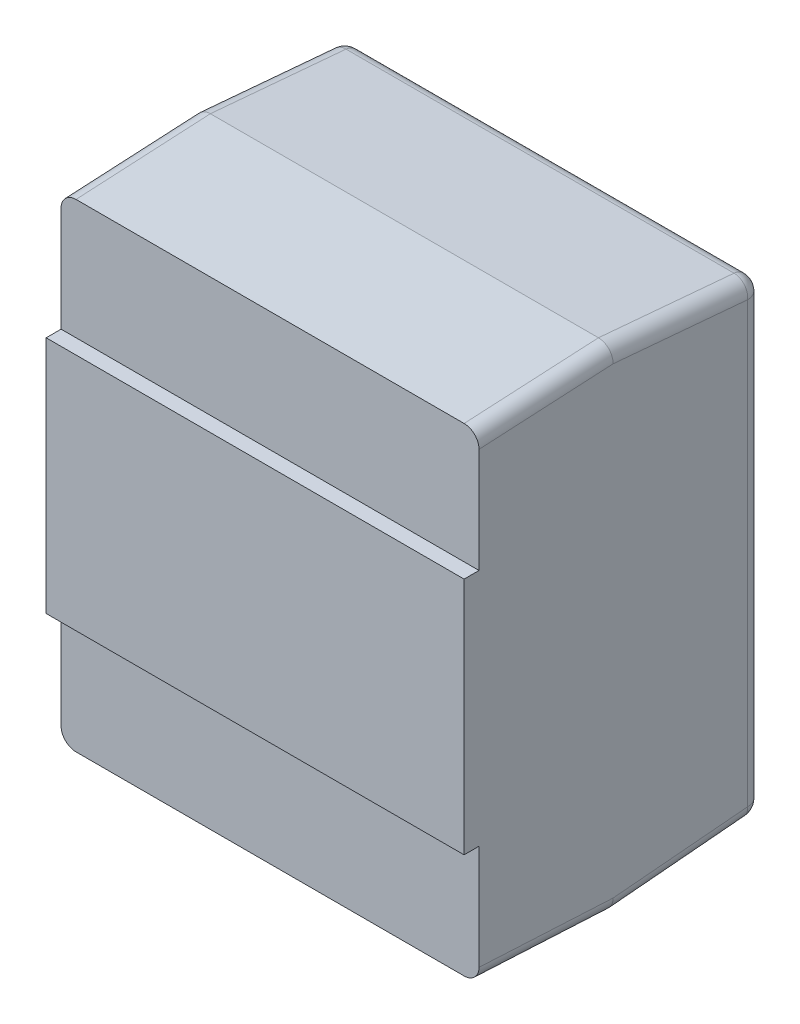
ISO-10303-21;
HEADER;
FILE_DESCRIPTION(('STEP AP214'),'2;1');
FILE_NAME('part.step','',(''),(''),'','','');
FILE_SCHEMA(('AUTOMOTIVE_DESIGN { 1 0 10303 214 1 1 1 1 }'));
ENDSEC;
DATA;
#1=APPLICATION_CONTEXT('core data for automotive mechanical design processes');
#2=APPLICATION_PROTOCOL_DEFINITION('international standard','automotive_design',2000,#1);
#3=PRODUCT_CONTEXT('',#1,'mechanical');
#4=PRODUCT('Part','Part','',(#3));
#5=PRODUCT_RELATED_PRODUCT_CATEGORY('part','',(#4));
#6=PRODUCT_DEFINITION_FORMATION('','',#4);
#7=PRODUCT_DEFINITION_CONTEXT('part definition',#1,'design');
#8=PRODUCT_DEFINITION('design','',#6,#7);
#9=PRODUCT_DEFINITION_SHAPE('','',#8);
#10=(LENGTH_UNIT() NAMED_UNIT(*) SI_UNIT(.MILLI.,.METRE.));
#11=(NAMED_UNIT(*) PLANE_ANGLE_UNIT() SI_UNIT($,.RADIAN.));
#12=(NAMED_UNIT(*) SI_UNIT($,.STERADIAN.) SOLID_ANGLE_UNIT());
#13=UNCERTAINTY_MEASURE_WITH_UNIT(LENGTH_MEASURE(1.E-05),#10,'distance_accuracy_value','');
#14=(GEOMETRIC_REPRESENTATION_CONTEXT(3) GLOBAL_UNCERTAINTY_ASSIGNED_CONTEXT((#13)) GLOBAL_UNIT_ASSIGNED_CONTEXT((#10,
#11,#12)) REPRESENTATION_CONTEXT('',''));
#15=CARTESIAN_POINT('',(0.,0.,0.));
#16=DIRECTION('',(0.,0.,1.));
#17=DIRECTION('',(1.,0.,0.));
#18=AXIS2_PLACEMENT_3D('',#15,#16,#17);
#19=CARTESIAN_POINT('',(18.49999934,-11.00000066,-1.611602067947));
#20=DIRECTION('',(0.,-8.74227767236097E-08,0.999999999999996));
#21=DIRECTION('',(0.,-0.999999999999996,-8.74227767236097E-08));
#22=AXIS2_PLACEMENT_3D('',#19,#20,#21);
#23=PLANE('',#22);
#24=DIRECTION('',(1.,-1.19248806067699E-08,0.));
#25=VECTOR('',#24,1.);
#26=CARTESIAN_POINT('',(20.29999934954,-10.20000068146,-1.611601998009));
#27=LINE('',#26,#25);
#28=CARTESIAN_POINT('',(19.89999934318,-10.20000067669,-1.61160199800893));
#29=VERTEX_POINT('',#28);
#30=CARTESIAN_POINT('',(17.09999934954,-10.2000006544303,-1.61160199800892));
#31=VERTEX_POINT('',#30);
#32=EDGE_CURVE('E285',#29,#31,#27,.F.);
#33=ORIENTED_EDGE('',*,*,#32,.T.);
#34=DIRECTION('',(0.,-0.999999999999996,-8.74227767236097E-08));
#35=VECTOR('',#34,1.);
#36=CARTESIAN_POINT('',(17.09999934954,-11.00000066,-1.611602067947));
#37=LINE('',#36,#35);
#38=CARTESIAN_POINT('',(17.09999933682,-11.8000006433,-1.61160213788574));
#39=VERTEX_POINT('',#38);
#40=EDGE_CURVE('E303',#31,#39,#37,.T.);
#41=ORIENTED_EDGE('',*,*,#40,.T.);
#42=DIRECTION('',(1.,-1.19248806067699E-08,0.));
#43=VECTOR('',#42,1.);
#44=CARTESIAN_POINT('',(16.69999933046,-11.80000063853,-1.611602137886));
#45=LINE('',#44,#43);
#46=CARTESIAN_POINT('',(19.89999933046,-11.8000006655597,-1.61160213788574));
#47=VERTEX_POINT('',#46);
#48=EDGE_CURVE('E298',#39,#47,#45,.T.);
#49=ORIENTED_EDGE('',*,*,#48,.T.);
#50=DIRECTION('',(0.,-0.999999999999996,-8.74227767236097E-08));
#51=VECTOR('',#50,1.);
#52=CARTESIAN_POINT('',(19.89999933046,-11.00000066,-1.611602067947));
#53=LINE('',#52,#51);
#54=EDGE_CURVE('E310',#47,#29,#53,.F.);
#55=ORIENTED_EDGE('',*,*,#54,.T.);
#56=EDGE_LOOP('',(#33,#41,#49,#55));
#57=FACE_BOUND('',#56,.T.);
#58=ADVANCED_FACE('F17',(#57),#23,.T.);
#59=CARTESIAN_POINT('',(16.69999933046,-11.80000063853,-1.611602137886));
#60=DIRECTION('',(1.192488060677E-08,0.999999999999996,8.74227767236097E-08));
#61=DIRECTION('',(0.,-8.74227767236097E-08,0.999999999999996));
#62=AXIS2_PLACEMENT_3D('',#59,#60,#61);
#63=PLANE('',#62);
#64=ORIENTED_EDGE('',*,*,#48,.F.);
#65=DIRECTION('',(0.,-8.74227767236097E-08,0.999999999999996));
#66=VECTOR('',#65,1.);
#67=CARTESIAN_POINT('',(17.09999933046,-11.8000006433,-1.611602137886));
#68=LINE('',#67,#66);
#69=CARTESIAN_POINT('',(17.099999324874,-11.8000006345592,-1.71160213788519));
#70=VERTEX_POINT('',#69);
#71=EDGE_CURVE('E301',#70,#39,#68,.T.);
#72=ORIENTED_EDGE('',*,*,#71,.F.);
#73=DIRECTION('',(1.,0.,0.));
#74=VECTOR('',#73,1.);
#75=CARTESIAN_POINT('',(18.499999322709,-11.80000063456,-1.71160213788519));
#76=LINE('',#75,#74);
#77=CARTESIAN_POINT('',(19.89999933046,-11.8000006456891,-1.71160213788546));
#78=VERTEX_POINT('',#77);
#79=EDGE_CURVE('E273',#70,#78,#76,.T.);
#80=ORIENTED_EDGE('',*,*,#79,.T.);
#81=DIRECTION('',(0.,-8.74227767236097E-08,0.999999999999996));
#82=VECTOR('',#81,1.);
#83=CARTESIAN_POINT('',(19.89999933046,-11.8000006766896,-1.611602137886));
#84=LINE('',#83,#82);
#85=EDGE_CURVE('E296',#47,#78,#84,.F.);
#86=ORIENTED_EDGE('',*,*,#85,.F.);
#87=EDGE_LOOP('',(#64,#72,#80,#86));
#88=FACE_BOUND('',#87,.T.);
#89=ADVANCED_FACE('F496',(#88),#63,.F.);
#90=CARTESIAN_POINT('',(20.29999934954,-10.20000068146,-1.611601998009));
#91=DIRECTION('',(-1.192488060677E-08,-0.999999999999996,-8.74227767236097E-08));
#92=DIRECTION('',(0.,8.74227767236097E-08,-0.999999999999996));
#93=AXIS2_PLACEMENT_3D('',#90,#91,#92);
#94=PLANE('',#93);
#95=DIRECTION('',(1.,0.,0.));
#96=VECTOR('',#95,1.);
#97=CARTESIAN_POINT('',(18.499999357291,-10.20000066795,-1.71160199800881));
#98=LINE('',#97,#96);
#99=CARTESIAN_POINT('',(19.899999355126,-10.2000006679493,-1.71160199800881));
#100=VERTEX_POINT('',#99);
#101=CARTESIAN_POINT('',(17.09999934954,-10.2000006568194,-1.71160199800887));
#102=VERTEX_POINT('',#101);
#103=EDGE_CURVE('E264',#100,#102,#98,.F.);
#104=ORIENTED_EDGE('',*,*,#103,.T.);
#105=DIRECTION('',(0.,8.74227767236097E-08,-0.999999999999996));
#106=VECTOR('',#105,1.);
#107=CARTESIAN_POINT('',(17.09999934954,-10.2000006433004,-1.611601998009));
#108=LINE('',#107,#106);
#109=EDGE_CURVE('E283',#31,#102,#108,.T.);
#110=ORIENTED_EDGE('',*,*,#109,.F.);
#111=ORIENTED_EDGE('',*,*,#32,.F.);
#112=DIRECTION('',(0.,8.74227767236097E-08,-0.999999999999996));
#113=VECTOR('',#112,1.);
#114=CARTESIAN_POINT('',(19.89999934954,-10.20000067669,-1.611601998009));
#115=LINE('',#114,#113);
#116=EDGE_CURVE('E153',#100,#29,#115,.F.);
#117=ORIENTED_EDGE('',*,*,#116,.F.);
#118=EDGE_LOOP('',(#104,#110,#111,#117));
#119=FACE_BOUND('',#118,.T.);
#120=ADVANCED_FACE('F494',(#119),#94,.F.);
#121=CARTESIAN_POINT('',(18.499999322709,-12.45000065125,-1.71160219471));
#122=DIRECTION('',(0.,8.74227767236097E-08,-0.999999999999996));
#123=DIRECTION('',(0.,0.999999999999996,8.74227767236097E-08));
#124=AXIS2_PLACEMENT_3D('',#121,#122,#123);
#125=PLANE('',#124);
#126=DIRECTION('',(0.,0.999999999999996,8.74227767236097E-08));
#127=VECTOR('',#126,1.);
#128=CARTESIAN_POINT('',(19.89999933046,-12.45000065125,-1.71160219471));
#129=LINE('',#128,#127);
#130=CARTESIAN_POINT('',(19.8999993241755,-12.5026964313939,-1.71160219931681));
#131=VERTEX_POINT('',#130);
#132=EDGE_CURVE('E269',#78,#131,#129,.F.);
#133=ORIENTED_EDGE('',*,*,#132,.F.);
#134=ORIENTED_EDGE('',*,*,#79,.F.);
#135=DIRECTION('',(0.,0.999999999999996,8.74227767236097E-08));
#136=VECTOR('',#135,1.);
#137=CARTESIAN_POINT('',(17.099999322081,-12.45000065125,-1.71160219471));
#138=LINE('',#137,#136);
#139=CARTESIAN_POINT('',(17.0999993220807,-12.5026963992011,-1.71160219931681));
#140=VERTEX_POINT('',#139);
#141=EDGE_CURVE('E148',#140,#70,#138,.T.);
#142=ORIENTED_EDGE('',*,*,#141,.F.);
#143=CARTESIAN_POINT('',(17.1999993220807,-12.5026963997989,-1.71160219931681));
#144=DIRECTION('',(0.,8.74227767236097E-08,-0.999999999999996));
#145=DIRECTION('',(-1.19248807609674E-08,-0.999999999999996,-8.74227767236097E-08));
#146=AXIS2_PLACEMENT_3D('',#143,#144,#145);
#147=ELLIPSE('',#146,0.100137234599792,0.1);
#148=CARTESIAN_POINT('',(17.1999993208882,-12.6028336344411,-1.71160220888117));
#149=VERTEX_POINT('',#148);
#150=EDGE_CURVE('E20',#149,#140,#147,.T.);
#151=ORIENTED_EDGE('',*,*,#150,.F.);
#152=DIRECTION('',(1.,-1.18922180420432E-08,6.23243695826995E-10));
#153=VECTOR('',#152,1.);
#154=CARTESIAN_POINT('',(19.899999320324,-12.6028336665925,-1.71160220800851));
#155=LINE('',#154,#153);
#156=CARTESIAN_POINT('',(19.799999320607,-12.6028336654021,-1.71160220807096));
#157=VERTEX_POINT('',#156);
#158=EDGE_CURVE('E145',#157,#149,#155,.F.);
#159=ORIENTED_EDGE('',*,*,#158,.F.);
#160=CARTESIAN_POINT('',(19.7999993220808,-12.5026964308011,-1.71160219931681));
#161=DIRECTION('',(0.,8.74227767236097E-08,-0.999999999999996));
#162=DIRECTION('',(1.19248809291825E-08,0.999999999999996,8.74227767236097E-08));
#163=AXIS2_PLACEMENT_3D('',#160,#161,#162);
#164=ELLIPSE('',#163,0.100137234599792,0.1);
#165=EDGE_CURVE('E329',#131,#157,#164,.T.);
#166=ORIENTED_EDGE('',*,*,#165,.F.);
#167=EDGE_LOOP('',(#133,#134,#142,#151,#159,#166));
#168=FACE_BOUND('',#167,.T.);
#169=ADVANCED_FACE('F143',(#168),#125,.F.);
#170=CARTESIAN_POINT('',(18.499999357291,-9.550000651258,-1.711601941184));
#171=DIRECTION('',(0.,8.74227767236097E-08,-0.999999999999996));
#172=DIRECTION('',(0.,0.999999999999996,8.74227767236097E-08));
#173=AXIS2_PLACEMENT_3D('',#170,#171,#172);
#174=PLANE('',#173);
#175=DIRECTION('',(0.,0.999999999999996,8.74227767236097E-08));
#176=VECTOR('',#175,1.);
#177=CARTESIAN_POINT('',(17.09999934954,-9.550000651258,-1.711601941184));
#178=LINE('',#177,#176);
#179=CARTESIAN_POINT('',(17.0999993558245,-9.49730487111515,-1.71160193657719));
#180=VERTEX_POINT('',#179);
#181=EDGE_CURVE('E261',#102,#180,#178,.T.);
#182=ORIENTED_EDGE('',*,*,#181,.F.);
#183=ORIENTED_EDGE('',*,*,#103,.F.);
#184=DIRECTION('',(0.,0.999999999999996,8.74227767236097E-08));
#185=VECTOR('',#184,1.);
#186=CARTESIAN_POINT('',(19.899999357919,-9.550000651258,-1.711601941184));
#187=LINE('',#186,#185);
#188=CARTESIAN_POINT('',(19.8999993579193,-9.49730490330894,-1.71160193657719));
#189=VERTEX_POINT('',#188);
#190=EDGE_CURVE('E267',#189,#100,#187,.F.);
#191=ORIENTED_EDGE('',*,*,#190,.F.);
#192=CARTESIAN_POINT('',(19.7999993579193,-9.49730490271411,-1.71160193657719));
#193=DIRECTION('',(0.,8.74227767236097E-08,-0.999999999999996));
#194=DIRECTION('',(1.19248809291834E-08,0.999999999999996,8.74227767236097E-08));
#195=AXIS2_PLACEMENT_3D('',#192,#193,#194);
#196=ELLIPSE('',#195,0.100137234599792,0.1);
#197=CARTESIAN_POINT('',(19.799999359114,-9.39716766807199,-1.71160192863317));
#198=VERTEX_POINT('',#197);
#199=EDGE_CURVE('E263',#198,#189,#196,.T.);
#200=ORIENTED_EDGE('',*,*,#199,.F.);
#201=DIRECTION('',(1.,-1.18922180319294E-08,-6.23245780309495E-10));
#202=VECTOR('',#201,1.);
#203=CARTESIAN_POINT('',(17.099999359676,-9.39716763592054,-1.71160192776066));
#204=LINE('',#203,#202);
#205=CARTESIAN_POINT('',(17.199999359393,-9.39716763710998,-1.71160192782295));
#206=VERTEX_POINT('',#205);
#207=EDGE_CURVE('E256',#206,#198,#204,.T.);
#208=ORIENTED_EDGE('',*,*,#207,.F.);
#209=CARTESIAN_POINT('',(17.1999993579192,-9.49730487170999,-1.71160193657719));
#210=DIRECTION('',(0.,8.74227767236097E-08,-0.999999999999996));
#211=DIRECTION('',(1.19248807609682E-08,0.999999999999996,8.74227767236097E-08));
#212=AXIS2_PLACEMENT_3D('',#209,#210,#211);
#213=ELLIPSE('',#212,0.100137234599792,0.1);
#214=EDGE_CURVE('E165',#180,#206,#213,.T.);
#215=ORIENTED_EDGE('',*,*,#214,.F.);
#216=EDGE_LOOP('',(#182,#183,#191,#200,#208,#215));
#217=FACE_BOUND('',#216,.T.);
#218=ADVANCED_FACE('F489',(#217),#174,.F.);
#219=CARTESIAN_POINT('',(19.799999358485,-9.449863541097,-2.616835528054));
#220=DIRECTION('',(6.24100046512234E-10,0.0523360435459213,-0.998629530179215));
#221=DIRECTION('',(0.,0.998629530179215,0.0523360435459213));
#222=AXIS2_PLACEMENT_3D('',#219,#220,#221);
#223=CYLINDRICAL_SURFACE('',#222,0.1);
#224=DIRECTION('',(-6.24103251220981E-10,-0.0523360435463406,0.998629530179193));
#225=VECTOR('',#224,1.);
#226=CARTESIAN_POINT('',(19.8999993584808,-9.450229511557,-2.609852430119));
#227=LINE('',#226,#225);
#228=CARTESIAN_POINT('',(19.8999993584808,-9.45022951155716,-2.60985243011582));
#229=VERTEX_POINT('',#228);
#230=EDGE_CURVE('E242',#229,#189,#227,.T.);
#231=ORIENTED_EDGE('',*,*,#230,.F.);
#232=CARTESIAN_POINT('',(19.7999993584807,-9.45022951036478,-2.60985243011265));
#233=DIRECTION('',(-2.08117868692122E-10,-0.0174523190278217,-0.999847696682125));
#234=DIRECTION('',(-1.19230647120563E-08,-0.999847696682125,0.017452319027821));
#235=AXIS2_PLACEMENT_3D('',#232,#233,#234);
#236=ELLIPSE('',#235,0.100244189808117,0.1);
#237=CARTESIAN_POINT('',(19.799999359395,-9.35000058796158,-2.61160192235098));
#238=VERTEX_POINT('',#237);
#239=EDGE_CURVE('E246',#238,#229,#236,.T.);
#240=ORIENTED_EDGE('',*,*,#239,.F.);
#241=DIRECTION('',(0.,-0.0523360435459213,0.998629530179215));
#242=VECTOR('',#241,1.);
#243=CARTESIAN_POINT('',(19.799999359114,-9.35000058799099,-2.61160192538276));
#244=LINE('',#243,#242);
#245=EDGE_CURVE('E259',#198,#238,#244,.F.);
#246=ORIENTED_EDGE('',*,*,#245,.F.);
#247=ORIENTED_EDGE('',*,*,#199,.T.);
#248=EDGE_LOOP('',(#231,#240,#246,#247));
#249=FACE_BOUND('',#248,.T.);
#250=ADVANCED_FACE('F334',(#249),#223,.T.);
#251=CARTESIAN_POINT('',(19.799999321569,-12.54561820536,-2.530599816498));
#252=DIRECTION('',(6.24100046511953E-10,0.0523358689399761,0.998629539329925));
#253=DIRECTION('',(0.,-0.998629539329925,0.0523358689399761));
#254=AXIS2_PLACEMENT_3D('',#251,#252,#253);
#255=CYLINDRICAL_SURFACE('',#254,0.1);
#256=DIRECTION('',(0.,-0.052335868939976,-0.998629539329925));
#257=VECTOR('',#256,1.);
#258=CARTESIAN_POINT('',(19.799999320324,-12.6500005880808,-2.61160221225732));
#259=LINE('',#258,#257);
#260=CARTESIAN_POINT('',(19.799999320798,-12.6500005880777,-2.6116022121991));
#261=VERTEX_POINT('',#260);
#262=EDGE_CURVE('E159',#261,#157,#259,.F.);
#263=ORIENTED_EDGE('',*,*,#262,.F.);
#264=CARTESIAN_POINT('',(19.7999993215191,-12.5497716660961,-2.60985270109758));
#265=DIRECTION('',(-2.0811786869237E-10,-0.0174524938467584,0.999847693630649));
#266=DIRECTION('',(-1.19230647120555E-08,-0.999847693630649,-0.0174524938467585));
#267=AXIS2_PLACEMENT_3D('',#264,#265,#266);
#268=ELLIPSE('',#267,0.100244189808117,0.1);
#269=CARTESIAN_POINT('',(19.8999993215191,-12.5497716672896,-2.6098527010933));
#270=VERTEX_POINT('',#269);
#271=EDGE_CURVE('E209',#270,#261,#268,.F.);
#272=ORIENTED_EDGE('',*,*,#271,.F.);
#273=DIRECTION('',(-6.24095536908959E-10,-0.0523358689460604,-0.998629539329606));
#274=VECTOR('',#273,1.);
#275=CARTESIAN_POINT('',(19.8999993220805,-12.50269643199,-1.711602199317));
#276=LINE('',#275,#274);
#277=EDGE_CURVE('E227',#131,#270,#276,.T.);
#278=ORIENTED_EDGE('',*,*,#277,.F.);
#279=ORIENTED_EDGE('',*,*,#165,.T.);
#280=EDGE_LOOP('',(#263,#272,#278,#279));
#281=FACE_BOUND('',#280,.T.);
#282=ADVANCED_FACE('F482',(#281),#255,.T.);
#283=CARTESIAN_POINT('',(19.799999321661,-12.53784750274,-2.746146374691));
#284=DIRECTION('',(-1.03932185456036E-09,-0.08715582983779,0.996194690472343));
#285=DIRECTION('',(0.,-0.996194690472343,-0.08715582983779));
#286=AXIS2_PLACEMENT_3D('',#283,#284,#285);
#287=CYLINDRICAL_SURFACE('',#286,0.1);
#288=ORIENTED_EDGE('',*,*,#271,.T.);
#289=DIRECTION('',(0.,0.08715582983779,-0.996194690472343));
#290=VECTOR('',#289,1.);
#291=CARTESIAN_POINT('',(19.799999321272,-12.6500005880866,-2.61160221209146));
#292=LINE('',#291,#290);
#293=CARTESIAN_POINT('',(19.799999321272,-12.5704981974341,-3.52031778043955));
#294=VERTEX_POINT('',#293);
#295=EDGE_CURVE('E207',#294,#261,#292,.F.);
#296=ORIENTED_EDGE('',*,*,#295,.F.);
#297=CARTESIAN_POINT('',(19.79999932246,-12.47087872847,-3.511602196536));
#298=DIRECTION('',(-1.03932202190983E-09,-0.0871558451008256,0.996194689136999));
#299=DIRECTION('',(-1.,1.19248803673219E-08,0.));
#300=AXIS2_PLACEMENT_3D('',#297,#298,#299);
#301=CIRCLE('',#300,0.1);
#302=CARTESIAN_POINT('',(19.8999993224599,-12.4708787296602,-3.5116021965357));
#303=VERTEX_POINT('',#302);
#304=EDGE_CURVE('E212',#303,#294,#301,.F.);
#305=ORIENTED_EDGE('',*,*,#304,.F.);
#306=DIRECTION('',(1.03931930984219E-09,0.0871558298391989,-0.996194690472219));
#307=VECTOR('',#306,1.);
#308=CARTESIAN_POINT('',(19.8999993215191,-12.54977166729,-2.609852701089));
#309=LINE('',#308,#307);
#310=EDGE_CURVE('E217',#270,#303,#309,.T.);
#311=ORIENTED_EDGE('',*,*,#310,.F.);
#312=EDGE_LOOP('',(#288,#296,#305,#311));
#313=FACE_BOUND('',#312,.T.);
#314=ADVANCED_FACE('F479',(#313),#287,.T.);
#315=CARTESIAN_POINT('',(19.899999320324,-12.65000058927,-2.611602212195));
#316=DIRECTION('',(-1.19085382253191E-08,-0.998629539329925,0.052335868939976));
#317=DIRECTION('',(0.,-0.052335868939976,-0.998629539329925));
#318=AXIS2_PLACEMENT_3D('',#315,#316,#317);
#319=PLANE('',#318);
#320=DIRECTION('',(-6.24100037708253E-10,-0.0523358689399761,-0.998629539329925));
#321=VECTOR('',#320,1.);
#322=CARTESIAN_POINT('',(17.199999320324,-12.650000557073,-2.611602212195));
#323=LINE('',#322,#321);
#324=CARTESIAN_POINT('',(17.199999320324,-12.6500005571906,-2.61160221084831));
#325=VERTEX_POINT('',#324);
#326=EDGE_CURVE('E157',#325,#149,#323,.F.);
#327=ORIENTED_EDGE('',*,*,#326,.F.);
#328=DIRECTION('',(1.,-1.18342979019187E-08,-1.03536794971302E-09));
#329=VECTOR('',#328,1.);
#330=CARTESIAN_POINT('',(19.899999320324,-12.650000589261,-2.61160221229832));
#331=LINE('',#330,#329);
#332=EDGE_CURVE('E193',#261,#325,#331,.F.);
#333=ORIENTED_EDGE('',*,*,#332,.F.);
#334=ORIENTED_EDGE('',*,*,#262,.T.);
#335=ORIENTED_EDGE('',*,*,#158,.T.);
#336=EDGE_LOOP('',(#327,#333,#334,#335));
#337=FACE_BOUND('',#336,.T.);
#338=ADVANCED_FACE('F155',(#337),#319,.T.);
#339=CARTESIAN_POINT('',(17.199999321512,-12.55038108802,-2.602886629211));
#340=DIRECTION('',(1.03932183989936E-09,0.08715582983779,-0.996194690472343));
#341=DIRECTION('',(0.,0.996194690472343,0.08715582983779));
#342=AXIS2_PLACEMENT_3D('',#339,#340,#341);
#343=CYLINDRICAL_SURFACE('',#342,0.1);
#344=CARTESIAN_POINT('',(17.1999993215193,-12.5497716350913,-2.60985270104791));
#345=DIRECTION('',(2.08117865756568E-10,0.0174524938467584,-0.999847693630649));
#346=DIRECTION('',(-1.19230645438654E-08,-0.999847693630649,-0.0174524938467585));
#347=AXIS2_PLACEMENT_3D('',#344,#345,#346);
#348=ELLIPSE('',#347,0.100244189808117,0.1);
#349=CARTESIAN_POINT('',(17.0999993215192,-12.5497716339018,-2.6098527010685));
#350=VERTEX_POINT('',#349);
#351=EDGE_CURVE('E163',#350,#325,#348,.F.);
#352=ORIENTED_EDGE('',*,*,#351,.F.);
#353=DIRECTION('',(-1.03932314266345E-09,-0.0871558298391989,0.996194690472219));
#354=VECTOR('',#353,1.);
#355=CARTESIAN_POINT('',(17.09999932246,-12.47087869627,-3.511602196536));
#356=LINE('',#355,#354);
#357=CARTESIAN_POINT('',(17.09999932246,-12.4708786997798,-3.51160217248679));
#358=VERTEX_POINT('',#357);
#359=EDGE_CURVE('E171',#358,#350,#356,.T.);
#360=ORIENTED_EDGE('',*,*,#359,.F.);
#361=CARTESIAN_POINT('',(17.19999932246,-12.47087869746,-3.511602196536));
#362=DIRECTION('',(-1.03932183977916E-09,-0.0871558298276607,0.996194690473229));
#363=DIRECTION('',(-1.,1.19248803673218E-08,0.));
#364=AXIS2_PLACEMENT_3D('',#361,#362,#363);
#365=CIRCLE('',#364,0.1);
#366=CARTESIAN_POINT('',(17.1999993208573,-12.5704981665086,-3.52031777951918));
#367=VERTEX_POINT('',#366);
#368=EDGE_CURVE('E175',#367,#358,#365,.F.);
#369=ORIENTED_EDGE('',*,*,#368,.F.);
#370=DIRECTION('',(0.,0.08715582983779,-0.996194690472343));
#371=VECTOR('',#370,1.);
#372=CARTESIAN_POINT('',(17.199999320324,-12.6500005573174,-2.61160220939951));
#373=LINE('',#372,#371);
#374=EDGE_CURVE('E181',#325,#367,#373,.T.);
#375=ORIENTED_EDGE('',*,*,#374,.F.);
#376=EDGE_LOOP('',(#352,#360,#369,#375));
#377=FACE_BOUND('',#376,.T.);
#378=ADVANCED_FACE('F473',(#377),#343,.T.);
#379=CARTESIAN_POINT('',(17.199999321515,-12.55013760314,-2.616835799089));
#380=DIRECTION('',(-6.24100037708253E-10,-0.0523358689399761,-0.998629539329925));
#381=DIRECTION('',(0.,0.998629539329925,-0.0523358689399761));
#382=AXIS2_PLACEMENT_3D('',#379,#380,#381);
#383=CYLINDRICAL_SURFACE('',#382,0.1);
#384=DIRECTION('',(6.24099394064846E-10,0.0523358689460623,0.998629539329606));
#385=VECTOR('',#384,1.);
#386=CARTESIAN_POINT('',(17.0999993215192,-12.5497716339,-2.609852701089));
#387=LINE('',#386,#385);
#388=EDGE_CURVE('E174',#350,#140,#387,.T.);
#389=ORIENTED_EDGE('',*,*,#388,.F.);
#390=ORIENTED_EDGE('',*,*,#351,.T.);
#391=ORIENTED_EDGE('',*,*,#326,.T.);
#392=ORIENTED_EDGE('',*,*,#150,.T.);
#393=EDGE_LOOP('',(#389,#390,#391,#392));
#394=FACE_BOUND('',#393,.T.);
#395=ADVANCED_FACE('F162',(#394),#383,.T.);
#396=CARTESIAN_POINT('',(17.199999358431,-9.454382953953,-2.530599546254));
#397=DIRECTION('',(6.24100037708534E-10,0.0523360435459213,-0.998629530179215));
#398=DIRECTION('',(0.,0.998629530179215,0.0523360435459213));
#399=AXIS2_PLACEMENT_3D('',#396,#397,#398);
#400=CYLINDRICAL_SURFACE('',#399,0.1);
#401=DIRECTION('',(0.,-0.0523360435459213,0.998629530179215));
#402=VECTOR('',#401,1.);
#403=CARTESIAN_POINT('',(17.199999359676,-9.35000055707122,-2.61160192376232));
#404=LINE('',#403,#402);
#405=CARTESIAN_POINT('',(17.199999359202,-9.35000055707442,-2.61160192369926));
#406=VERTEX_POINT('',#405);
#407=EDGE_CURVE('E260',#406,#206,#404,.T.);
#408=ORIENTED_EDGE('',*,*,#407,.F.);
#409=CARTESIAN_POINT('',(17.1999993584809,-9.45022947936041,-2.60985243011724));
#410=DIRECTION('',(-2.0811786575632E-10,-0.0174523190278217,-0.999847696682125));
#411=DIRECTION('',(-1.19230645438661E-08,-0.999847696682125,0.017452319027821));
#412=AXIS2_PLACEMENT_3D('',#409,#410,#411);
#413=ELLIPSE('',#412,0.100244189808117,0.1);
#414=CARTESIAN_POINT('',(17.0999993584809,-9.45022947816792,-2.60985243011812));
#415=VERTEX_POINT('',#414);
#416=EDGE_CURVE('E323',#415,#406,#413,.T.);
#417=ORIENTED_EDGE('',*,*,#416,.F.);
#418=DIRECTION('',(6.2409939406513E-10,0.0523360435452308,-0.998629530179251));
#419=VECTOR('',#418,1.);
#420=CARTESIAN_POINT('',(17.0999993579195,-9.497304870517,-1.711601936578));
#421=LINE('',#420,#419);
#422=EDGE_CURVE('E169',#180,#415,#421,.T.);
#423=ORIENTED_EDGE('',*,*,#422,.F.);
#424=ORIENTED_EDGE('',*,*,#214,.T.);
#425=EDGE_LOOP('',(#408,#417,#423,#424));
#426=FACE_BOUND('',#425,.T.);
#427=ADVANCED_FACE('F467',(#426),#400,.T.);
#428=CARTESIAN_POINT('',(17.199999358339,-9.462153618887,-2.746146105805));
#429=DIRECTION('',(-1.03932183989914E-09,-0.0871556556575621,-0.996194705711138));
#430=DIRECTION('',(0.,0.996194705711138,-0.0871556556575621));
#431=AXIS2_PLACEMENT_3D('',#428,#429,#430);
#432=CYLINDRICAL_SURFACE('',#431,0.1);
#433=ORIENTED_EDGE('',*,*,#416,.T.);
#434=DIRECTION('',(0.,0.0871556556575621,0.996194705711138));
#435=VECTOR('',#434,1.);
#436=CARTESIAN_POINT('',(17.199999358728,-9.35000055706543,-2.61160192359646));
#437=LINE('',#436,#435);
#438=CARTESIAN_POINT('',(17.199999358728,-9.42950278878442,-3.52031750530874));
#439=VERTEX_POINT('',#438);
#440=EDGE_CURVE('E374',#439,#406,#437,.T.);
#441=ORIENTED_EDGE('',*,*,#440,.F.);
#442=CARTESIAN_POINT('',(17.19999935754,-9.529122259322,-3.511601939359));
#443=DIRECTION('',(-1.0393218757329E-09,-0.0871556586624748,-0.996194705448242));
#444=DIRECTION('',(-1.,1.19248824444E-08,0.));
#445=AXIS2_PLACEMENT_3D('',#442,#443,#444);
#446=CIRCLE('',#445,0.1);
#447=CARTESIAN_POINT('',(17.0999993575401,-9.52912225812995,-3.51160193935916));
#448=VERTEX_POINT('',#447);
#449=EDGE_CURVE('E377',#448,#439,#446,.T.);
#450=ORIENTED_EDGE('',*,*,#449,.F.);
#451=DIRECTION('',(-1.03931930984352E-09,-0.0871556556578733,-0.996194705711111));
#452=VECTOR('',#451,1.);
#453=CARTESIAN_POINT('',(17.0999993584809,-9.450229478168,-2.609852430119));
#454=LINE('',#453,#452);
#455=EDGE_CURVE('E381',#415,#448,#454,.T.);
#456=ORIENTED_EDGE('',*,*,#455,.F.);
#457=EDGE_LOOP('',(#433,#441,#450,#456));
#458=FACE_BOUND('',#457,.T.);
#459=ADVANCED_FACE('F463',(#458),#432,.T.);
#460=CARTESIAN_POINT('',(17.099999359676,-9.350000555882,-2.6116019237));
#461=DIRECTION('',(1.19085383243126E-08,0.998629530179215,0.0523360435459213));
#462=DIRECTION('',(0.,-0.0523360435459213,0.998629530179215));
#463=AXIS2_PLACEMENT_3D('',#460,#461,#462);
#464=PLANE('',#463);
#465=ORIENTED_EDGE('',*,*,#245,.T.);
#466=DIRECTION('',(1.,-1.18342981813198E-08,1.03536588914487E-09));
#467=VECTOR('',#466,1.);
#468=CARTESIAN_POINT('',(17.099999359676,-9.35000055589106,-2.61160192380358));
#469=LINE('',#468,#467);
#470=EDGE_CURVE('E356',#406,#238,#469,.T.);
#471=ORIENTED_EDGE('',*,*,#470,.F.);
#472=ORIENTED_EDGE('',*,*,#407,.T.);
#473=ORIENTED_EDGE('',*,*,#207,.T.);
#474=EDGE_LOOP('',(#465,#471,#472,#473));
#475=FACE_BOUND('',#474,.T.);
#476=ADVANCED_FACE('F460',(#475),#464,.T.);
#477=CARTESIAN_POINT('',(19.799999358488,-9.449620058651,-2.602886358134));
#478=DIRECTION('',(-1.03932185456014E-09,-0.0871556556575621,-0.996194705711138));
#479=DIRECTION('',(0.,0.996194705711138,-0.0871556556575621));
#480=AXIS2_PLACEMENT_3D('',#477,#478,#479);
#481=CYLINDRICAL_SURFACE('',#480,0.1);
#482=ORIENTED_EDGE('',*,*,#239,.T.);
#483=DIRECTION('',(1.03932314266478E-09,0.0871556556578733,0.996194705711111));
#484=VECTOR('',#483,1.);
#485=CARTESIAN_POINT('',(19.89999935754,-9.529122291519,-3.511601939359));
#486=LINE('',#485,#484);
#487=CARTESIAN_POINT('',(19.89999935754,-9.52912229339397,-3.51160195007473));
#488=VERTEX_POINT('',#487);
#489=EDGE_CURVE('E243',#488,#229,#486,.T.);
#490=ORIENTED_EDGE('',*,*,#489,.F.);
#491=CARTESIAN_POINT('',(19.79999935754,-9.529122290327,-3.511601939359));
#492=DIRECTION('',(-1.03932183992967E-09,-0.087155655660077,-0.996194705710918));
#493=DIRECTION('',(-1.,1.19248824444E-08,0.));
#494=AXIS2_PLACEMENT_3D('',#491,#492,#493);
#495=CIRCLE('',#494,0.1);
#496=CARTESIAN_POINT('',(19.799999359676,-9.42950281975523,-3.52031750492492));
#497=VERTEX_POINT('',#496);
#498=EDGE_CURVE('E253',#497,#488,#495,.T.);
#499=ORIENTED_EDGE('',*,*,#498,.F.);
#500=DIRECTION('',(0.,0.0871556556575621,0.996194705711138));
#501=VECTOR('',#500,1.);
#502=CARTESIAN_POINT('',(19.799999359676,-9.3500005878346,-2.61160192090451));
#503=LINE('',#502,#501);
#504=EDGE_CURVE('E354',#238,#497,#503,.F.);
#505=ORIENTED_EDGE('',*,*,#504,.F.);
#506=EDGE_LOOP('',(#482,#490,#499,#505));
#507=FACE_BOUND('',#506,.T.);
#508=ADVANCED_FACE('F344',(#507),#481,.T.);
#509=CARTESIAN_POINT('',(19.899999359676,-9.350000589272,-2.6116019237));
#510=DIRECTION('',(1.,-1.192488092918E-08,0.));
#511=DIRECTION('',(1.192488092918E-08,1.,0.));
#512=AXIS2_PLACEMENT_3D('',#509,#510,#511);
#513=PLANE('',#512);
#514=ORIENTED_EDGE('',*,*,#277,.T.);
#515=ORIENTED_EDGE('',*,*,#310,.T.);
#516=DIRECTION('',(-1.192488092918E-08,-0.999999999999996,-8.74227767236097E-08));
#517=VECTOR('',#516,1.);
#518=CARTESIAN_POINT('',(19.899999349838,-10.1750005105825,-3.51160199582347));
#519=LINE('',#518,#517);
#520=EDGE_CURVE('E232',#488,#303,#519,.T.);
#521=ORIENTED_EDGE('',*,*,#520,.F.);
#522=ORIENTED_EDGE('',*,*,#489,.T.);
#523=ORIENTED_EDGE('',*,*,#230,.T.);
#524=ORIENTED_EDGE('',*,*,#190,.T.);
#525=ORIENTED_EDGE('',*,*,#116,.T.);
#526=ORIENTED_EDGE('',*,*,#54,.F.);
#527=ORIENTED_EDGE('',*,*,#85,.T.);
#528=ORIENTED_EDGE('',*,*,#132,.T.);
#529=EDGE_LOOP('',(#514,#515,#521,#522,#523,#524,#525,#526,#527,#528));
#530=FACE_BOUND('',#529,.T.);
#531=ADVANCED_FACE('F339',(#530),#513,.T.);
#532=CARTESIAN_POINT('',(19.79999932246,-12.47087872847,-3.511602196536));
#533=DIRECTION('',(-1.,1.19248807609699E-08,0.));
#534=DIRECTION('',(0.,8.74227767236097E-08,-0.999999999999996));
#535=AXIS2_PLACEMENT_3D('',#532,#533,#534);
#536=SPHERICAL_SURFACE('',#535,0.1);
#537=ORIENTED_EDGE('',*,*,#304,.T.);
#538=CARTESIAN_POINT('',(19.79999932246,-12.4708787284649,-3.511602196536));
#539=DIRECTION('',(-1.,1.192488086009E-08,0.));
#540=DIRECTION('',(-1.192488086009E-08,-1.,0.));
#541=AXIS2_PLACEMENT_3D('',#538,#539,#540);
#542=CIRCLE('',#541,0.1);
#543=CARTESIAN_POINT('',(19.799999326845,-12.4708787197258,-3.61160219653592));
#544=VERTEX_POINT('',#543);
#545=EDGE_CURVE('E203',#544,#294,#542,.T.);
#546=ORIENTED_EDGE('',*,*,#545,.F.);
#547=CARTESIAN_POINT('',(19.7999993224599,-12.4708787284675,-3.51160219653605));
#548=DIRECTION('',(-1.192488092918E-08,-0.999999999999996,-8.74227767236097E-08));
#549=DIRECTION('',(0.,8.74227767236097E-08,-0.999999999999996));
#550=AXIS2_PLACEMENT_3D('',#547,#548,#549);
#551=CIRCLE('',#550,0.1);
#552=EDGE_CURVE('E222',#303,#544,#551,.F.);
#553=ORIENTED_EDGE('',*,*,#552,.F.);
#554=EDGE_LOOP('',(#537,#546,#553));
#555=FACE_BOUND('',#554,.T.);
#556=ADVANCED_FACE('F452',(#555),#536,.T.);
#557=CARTESIAN_POINT('',(19.899999320324,-12.65000058927,-2.611602212195));
#558=DIRECTION('',(-1.18795030882041E-08,-0.996194690472342,-0.08715582983779));
#559=DIRECTION('',(0.,0.08715582983779,-0.996194690472343));
#560=AXIS2_PLACEMENT_3D('',#557,#558,#559);
#561=PLANE('',#560);
#562=ORIENTED_EDGE('',*,*,#332,.T.);
#563=ORIENTED_EDGE('',*,*,#374,.T.);
#564=DIRECTION('',(-1.,1.192488086009E-08,0.));
#565=VECTOR('',#564,1.);
#566=CARTESIAN_POINT('',(19.199999321272,-12.5704981903573,-3.52031777951919));
#567=LINE('',#566,#565);
#568=EDGE_CURVE('E198',#294,#367,#567,.T.);
#569=ORIENTED_EDGE('',*,*,#568,.F.);
#570=ORIENTED_EDGE('',*,*,#295,.T.);
#571=EDGE_LOOP('',(#562,#563,#569,#570));
#572=FACE_BOUND('',#571,.T.);
#573=ADVANCED_FACE('F445',(#572),#561,.T.);
#574=CARTESIAN_POINT('',(17.19999932246,-12.47087869746,-3.511602196536));
#575=DIRECTION('',(-1.,1.19248807609699E-08,0.));
#576=DIRECTION('',(0.,8.74227767236097E-08,-0.999999999999996));
#577=AXIS2_PLACEMENT_3D('',#574,#575,#576);
#578=SPHERICAL_SURFACE('',#577,0.1);
#579=ORIENTED_EDGE('',*,*,#368,.T.);
#580=CARTESIAN_POINT('',(17.19999932246,-12.4708786974623,-3.51160219653547));
#581=DIRECTION('',(1.192488076097E-08,0.999999999999996,8.74227767236097E-08));
#582=DIRECTION('',(0.,-8.74227767236097E-08,0.999999999999996));
#583=AXIS2_PLACEMENT_3D('',#580,#581,#582);
#584=CIRCLE('',#583,0.1);
#585=CARTESIAN_POINT('',(17.19999932246,-12.4708786925939,-3.61160219653584));
#586=VERTEX_POINT('',#585);
#587=EDGE_CURVE('E184',#586,#358,#584,.T.);
#588=ORIENTED_EDGE('',*,*,#587,.F.);
#589=CARTESIAN_POINT('',(17.1999993224599,-12.4708786974602,-3.511602196536));
#590=DIRECTION('',(-1.,1.192488086009E-08,0.));
#591=DIRECTION('',(-1.192488086009E-08,-1.,0.));
#592=AXIS2_PLACEMENT_3D('',#589,#590,#591);
#593=CIRCLE('',#592,0.1);
#594=EDGE_CURVE('E188',#367,#586,#593,.F.);
#595=ORIENTED_EDGE('',*,*,#594,.F.);
#596=EDGE_LOOP('',(#579,#588,#595));
#597=FACE_BOUND('',#596,.T.);
#598=ADVANCED_FACE('F442',(#597),#578,.T.);
#599=CARTESIAN_POINT('',(17.099999320324,-12.65000055588,-2.611602212195));
#600=DIRECTION('',(-1.,1.192488076097E-08,0.));
#601=DIRECTION('',(-1.192488076097E-08,-1.,0.));
#602=AXIS2_PLACEMENT_3D('',#599,#600,#601);
#603=PLANE('',#602);
#604=ORIENTED_EDGE('',*,*,#422,.T.);
#605=ORIENTED_EDGE('',*,*,#455,.T.);
#606=DIRECTION('',(1.192488076097E-08,0.999999999999996,8.74227767236097E-08));
#607=VECTOR('',#606,1.);
#608=CARTESIAN_POINT('',(17.099999330162,-11.8250004771975,-3.51160214007153));
#609=LINE('',#608,#607);
#610=EDGE_CURVE('E187',#358,#448,#609,.T.);
#611=ORIENTED_EDGE('',*,*,#610,.F.);
#612=ORIENTED_EDGE('',*,*,#359,.T.);
#613=ORIENTED_EDGE('',*,*,#388,.T.);
#614=ORIENTED_EDGE('',*,*,#141,.T.);
#615=ORIENTED_EDGE('',*,*,#71,.T.);
#616=ORIENTED_EDGE('',*,*,#40,.F.);
#617=ORIENTED_EDGE('',*,*,#109,.T.);
#618=ORIENTED_EDGE('',*,*,#181,.T.);
#619=EDGE_LOOP('',(#604,#605,#611,#612,#613,#614,#615,#616,#617,#618));
#620=FACE_BOUND('',#619,.T.);
#621=ADVANCED_FACE('F404',(#620),#603,.T.);
#622=CARTESIAN_POINT('',(17.19999935754,-9.529122259322,-3.511601939359));
#623=DIRECTION('',(-1.,1.19248807609699E-08,0.));
#624=DIRECTION('',(0.,8.74227767236097E-08,-0.999999999999996));
#625=AXIS2_PLACEMENT_3D('',#622,#623,#624);
#626=SPHERICAL_SURFACE('',#625,0.1);
#627=ORIENTED_EDGE('',*,*,#449,.T.);
#628=CARTESIAN_POINT('',(17.19999935754,-9.52912225932207,-3.511601939359));
#629=DIRECTION('',(1.,-1.192488095922E-08,0.));
#630=DIRECTION('',(1.192488095922E-08,1.,0.));
#631=AXIS2_PLACEMENT_3D('',#628,#629,#630);
#632=CIRCLE('',#631,0.1);
#633=CARTESIAN_POINT('',(17.199999353155,-9.52912225057983,-3.61160193935895));
#634=VERTEX_POINT('',#633);
#635=EDGE_CURVE('E35',#634,#439,#632,.T.);
#636=ORIENTED_EDGE('',*,*,#635,.F.);
#637=CARTESIAN_POINT('',(17.1999993575401,-9.52912225932249,-3.51160193935895));
#638=DIRECTION('',(1.192488076097E-08,0.999999999999996,8.74227767236097E-08));
#639=DIRECTION('',(0.,-8.74227767236097E-08,0.999999999999996));
#640=AXIS2_PLACEMENT_3D('',#637,#638,#639);
#641=CIRCLE('',#640,0.1);
#642=EDGE_CURVE('E385',#448,#634,#641,.F.);
#643=ORIENTED_EDGE('',*,*,#642,.F.);
#644=EDGE_LOOP('',(#627,#636,#643));
#645=FACE_BOUND('',#644,.T.);
#646=ADVANCED_FACE('F408',(#645),#626,.T.);
#647=CARTESIAN_POINT('',(17.099999359676,-9.350000555882,-2.6116019237));
#648=DIRECTION('',(1.18795031869516E-08,0.996194705711138,-0.0871556556575621));
#649=DIRECTION('',(0.,0.0871556556575621,0.996194705711138));
#650=AXIS2_PLACEMENT_3D('',#647,#648,#649);
#651=PLANE('',#650);
#652=ORIENTED_EDGE('',*,*,#470,.T.);
#653=ORIENTED_EDGE('',*,*,#504,.T.);
#654=DIRECTION('',(1.,-1.192488095922E-08,0.));
#655=VECTOR('',#654,1.);
#656=CARTESIAN_POINT('',(17.7999993587279,-9.42950279590591,-3.520317504925));
#657=LINE('',#656,#655);
#658=EDGE_CURVE('E365',#439,#497,#657,.T.);
#659=ORIENTED_EDGE('',*,*,#658,.F.);
#660=ORIENTED_EDGE('',*,*,#440,.T.);
#661=EDGE_LOOP('',(#652,#653,#659,#660));
#662=FACE_BOUND('',#661,.T.);
#663=ADVANCED_FACE('F412',(#662),#651,.T.);
#664=CARTESIAN_POINT('',(19.79999935754,-9.529122290327,-3.511601939359));
#665=DIRECTION('',(-1.,1.19248807609699E-08,0.));
#666=DIRECTION('',(0.,8.74227767236097E-08,-0.999999999999996));
#667=AXIS2_PLACEMENT_3D('',#664,#665,#666);
#668=SPHERICAL_SURFACE('',#667,0.1);
#669=ORIENTED_EDGE('',*,*,#498,.T.);
#670=CARTESIAN_POINT('',(19.79999935754,-9.52912229032628,-3.51160193935953));
#671=DIRECTION('',(-1.192488092918E-08,-0.999999999999996,-8.74227767236097E-08));
#672=DIRECTION('',(0.,8.74227767236097E-08,-0.999999999999996));
#673=AXIS2_PLACEMENT_3D('',#670,#671,#672);
#674=CIRCLE('',#673,0.1);
#675=CARTESIAN_POINT('',(19.79999935754,-9.52912227770886,-3.6116019393591));
#676=VERTEX_POINT('',#675);
#677=EDGE_CURVE('E237',#676,#488,#674,.T.);
#678=ORIENTED_EDGE('',*,*,#677,.F.);
#679=CARTESIAN_POINT('',(19.7999993575401,-9.52912229032676,-3.511601939359));
#680=DIRECTION('',(1.,-1.192488095922E-08,0.));
#681=DIRECTION('',(1.192488095922E-08,1.,0.));
#682=AXIS2_PLACEMENT_3D('',#679,#680,#681);
#683=CIRCLE('',#682,0.1);
#684=EDGE_CURVE('E352',#497,#676,#683,.F.);
#685=ORIENTED_EDGE('',*,*,#684,.F.);
#686=EDGE_LOOP('',(#669,#678,#685));
#687=FACE_BOUND('',#686,.T.);
#688=ADVANCED_FACE('F349',(#687),#668,.T.);
#689=CARTESIAN_POINT('',(19.799999349838,-10.17500050939,-3.511601995824));
#690=DIRECTION('',(-1.192488092918E-08,-0.999999999999996,-8.74227767236097E-08));
#691=DIRECTION('',(0.,8.74227767236097E-08,-0.999999999999996));
#692=AXIS2_PLACEMENT_3D('',#689,#690,#691);
#693=CYLINDRICAL_SURFACE('',#692,0.1);
#694=ORIENTED_EDGE('',*,*,#552,.T.);
#695=DIRECTION('',(0.,0.999999999999996,8.74227767236097E-08));
#696=VECTOR('',#695,1.);
#697=CARTESIAN_POINT('',(19.79999935754,-11.00000048515,-3.611602067947));
#698=LINE('',#697,#696);
#699=EDGE_CURVE('E364',#676,#544,#698,.F.);
#700=ORIENTED_EDGE('',*,*,#699,.F.);
#701=ORIENTED_EDGE('',*,*,#677,.T.);
#702=ORIENTED_EDGE('',*,*,#520,.T.);
#703=EDGE_LOOP('',(#694,#700,#701,#702));
#704=FACE_BOUND('',#703,.T.);
#705=ADVANCED_FACE('F434',(#704),#693,.T.);
#706=CARTESIAN_POINT('',(19.19999932246,-12.47087872131,-3.511602196536));
#707=DIRECTION('',(-1.,1.192488086009E-08,0.));
#708=DIRECTION('',(-1.192488086009E-08,-1.,0.));
#709=AXIS2_PLACEMENT_3D('',#706,#707,#708);
#710=CYLINDRICAL_SURFACE('',#709,0.1);
#711=ORIENTED_EDGE('',*,*,#594,.T.);
#712=DIRECTION('',(1.,0.,0.));
#713=VECTOR('',#712,1.);
#714=CARTESIAN_POINT('',(18.49999934,-12.47087871972,-3.61160219653526));
#715=LINE('',#714,#713);
#716=EDGE_CURVE('E421',#544,#586,#715,.F.);
#717=ORIENTED_EDGE('',*,*,#716,.F.);
#718=ORIENTED_EDGE('',*,*,#545,.T.);
#719=ORIENTED_EDGE('',*,*,#568,.T.);
#720=EDGE_LOOP('',(#711,#717,#718,#719));
#721=FACE_BOUND('',#720,.T.);
#722=ADVANCED_FACE('F514',(#721),#710,.T.);
#723=CARTESIAN_POINT('',(17.199999330162,-11.82500047839,-3.511602140071));
#724=DIRECTION('',(1.192488076097E-08,0.999999999999996,8.74227767236097E-08));
#725=DIRECTION('',(0.,-8.74227767236097E-08,0.999999999999996));
#726=AXIS2_PLACEMENT_3D('',#723,#724,#725);
#727=CYLINDRICAL_SURFACE('',#726,0.1);
#728=ORIENTED_EDGE('',*,*,#642,.T.);
#729=DIRECTION('',(0.,0.999999999999996,8.74227767236097E-08));
#730=VECTOR('',#729,1.);
#731=CARTESIAN_POINT('',(17.19999932246,-11.00000048515,-3.611602067947));
#732=LINE('',#731,#730);
#733=EDGE_CURVE('E26',#586,#634,#732,.T.);
#734=ORIENTED_EDGE('',*,*,#733,.F.);
#735=ORIENTED_EDGE('',*,*,#587,.T.);
#736=ORIENTED_EDGE('',*,*,#610,.T.);
#737=EDGE_LOOP('',(#728,#734,#735,#736));
#738=FACE_BOUND('',#737,.T.);
#739=ADVANCED_FACE('F399',(#738),#727,.T.);
#740=CARTESIAN_POINT('',(17.79999935754,-9.529122266477,-3.511601939359));
#741=DIRECTION('',(1.,-1.192488095922E-08,0.));
#742=DIRECTION('',(1.192488095922E-08,1.,0.));
#743=AXIS2_PLACEMENT_3D('',#740,#741,#742);
#744=CYLINDRICAL_SURFACE('',#743,0.1);
#745=ORIENTED_EDGE('',*,*,#684,.T.);
#746=DIRECTION('',(1.,0.,0.));
#747=VECTOR('',#746,1.);
#748=CARTESIAN_POINT('',(18.49999934,-9.52912225058,-3.61160193935874));
#749=LINE('',#748,#747);
#750=EDGE_CURVE('E11',#634,#676,#749,.T.);
#751=ORIENTED_EDGE('',*,*,#750,.F.);
#752=ORIENTED_EDGE('',*,*,#635,.T.);
#753=ORIENTED_EDGE('',*,*,#658,.T.);
#754=EDGE_LOOP('',(#745,#751,#752,#753));
#755=FACE_BOUND('',#754,.T.);
#756=ADVANCED_FACE('F414',(#755),#744,.T.);
#757=CARTESIAN_POINT('',(18.49999934,-11.00000048515,-3.611602067947));
#758=DIRECTION('',(0.,8.74227767236097E-08,-0.999999999999996));
#759=DIRECTION('',(0.,0.999999999999996,8.74227767236097E-08));
#760=AXIS2_PLACEMENT_3D('',#757,#758,#759);
#761=PLANE('',#760);
#762=ORIENTED_EDGE('',*,*,#733,.T.);
#763=ORIENTED_EDGE('',*,*,#750,.T.);
#764=ORIENTED_EDGE('',*,*,#699,.T.);
#765=ORIENTED_EDGE('',*,*,#716,.T.);
#766=EDGE_LOOP('',(#762,#763,#764,#765));
#767=FACE_BOUND('',#766,.T.);
#768=ADVANCED_FACE('F419',(#767),#761,.T.);
#769=CLOSED_SHELL('',(#58,#89,#120,#169,#218,#250,#282,#314,#338,#378,#395,#427,#459,#476,#508,
#531,#556,#573,#598,#621,#646,#663,#688,#705,#722,#739,#756,#768));
#770=MANIFOLD_SOLID_BREP('B1',#769);
#771=ADVANCED_BREP_SHAPE_REPRESENTATION('',(#18,#770),#14);
#772=SHAPE_DEFINITION_REPRESENTATION(#9,#771);
ENDSEC;
END-ISO-10303-21;
